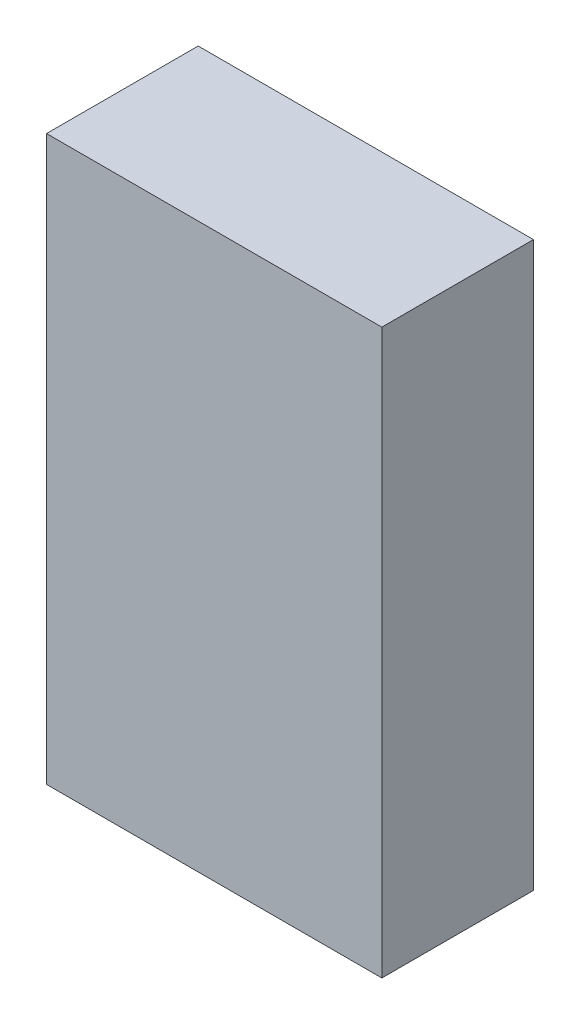
ISO-10303-21;
HEADER;
FILE_DESCRIPTION(('STEP AP214'),'2;1');
FILE_NAME('part.step','',(''),(''),'','','');
FILE_SCHEMA(('AUTOMOTIVE_DESIGN { 1 0 10303 214 1 1 1 1 }'));
ENDSEC;
DATA;
#1=APPLICATION_CONTEXT('core data for automotive mechanical design processes');
#2=APPLICATION_PROTOCOL_DEFINITION('international standard','automotive_design',2000,#1);
#3=PRODUCT_CONTEXT('',#1,'mechanical');
#4=PRODUCT('Part','Part','',(#3));
#5=PRODUCT_RELATED_PRODUCT_CATEGORY('part','',(#4));
#6=PRODUCT_DEFINITION_FORMATION('','',#4);
#7=PRODUCT_DEFINITION_CONTEXT('part definition',#1,'design');
#8=PRODUCT_DEFINITION('design','',#6,#7);
#9=PRODUCT_DEFINITION_SHAPE('','',#8);
#10=(LENGTH_UNIT() NAMED_UNIT(*) SI_UNIT(.MILLI.,.METRE.));
#11=(NAMED_UNIT(*) PLANE_ANGLE_UNIT() SI_UNIT($,.RADIAN.));
#12=(NAMED_UNIT(*) SI_UNIT($,.STERADIAN.) SOLID_ANGLE_UNIT());
#13=UNCERTAINTY_MEASURE_WITH_UNIT(LENGTH_MEASURE(1.E-05),#10,'distance_accuracy_value','');
#14=(GEOMETRIC_REPRESENTATION_CONTEXT(3) GLOBAL_UNCERTAINTY_ASSIGNED_CONTEXT((#13)) GLOBAL_UNIT_ASSIGNED_CONTEXT((#10,
#11,#12)) REPRESENTATION_CONTEXT('',''));
#15=CARTESIAN_POINT('',(0.,0.,0.));
#16=DIRECTION('',(0.,0.,1.));
#17=DIRECTION('',(1.,0.,0.));
#18=AXIS2_PLACEMENT_3D('',#15,#16,#17);
#19=CARTESIAN_POINT('',(17.25,-29.,15.6));
#20=DIRECTION('',(-1.,0.,0.));
#21=DIRECTION('',(0.,0.,1.));
#22=AXIS2_PLACEMENT_3D('',#19,#20,#21);
#23=PLANE('',#22);
#24=DIRECTION('',(0.,1.,0.));
#25=VECTOR('',#24,1.);
#26=CARTESIAN_POINT('',(17.25,-29.,0.));
#27=LINE('',#26,#25);
#28=CARTESIAN_POINT('',(17.25,-29.,0.));
#29=VERTEX_POINT('',#28);
#30=CARTESIAN_POINT('',(17.25,29.,0.));
#31=VERTEX_POINT('',#30);
#32=EDGE_CURVE('E112',#29,#31,#27,.T.);
#33=ORIENTED_EDGE('',*,*,#32,.T.);
#34=DIRECTION('',(0.,0.,-1.));
#35=VECTOR('',#34,1.);
#36=CARTESIAN_POINT('',(17.25,29.,15.6));
#37=LINE('',#36,#35);
#38=CARTESIAN_POINT('',(17.25,29.,15.6));
#39=VERTEX_POINT('',#38);
#40=EDGE_CURVE('E11',#39,#31,#37,.T.);
#41=ORIENTED_EDGE('',*,*,#40,.F.);
#42=DIRECTION('',(0.,1.,0.));
#43=VECTOR('',#42,1.);
#44=CARTESIAN_POINT('',(17.25,-29.,15.6));
#45=LINE('',#44,#43);
#46=CARTESIAN_POINT('',(17.25,-29.,15.6));
#47=VERTEX_POINT('',#46);
#48=EDGE_CURVE('E95',#47,#39,#45,.T.);
#49=ORIENTED_EDGE('',*,*,#48,.F.);
#50=DIRECTION('',(0.,0.,-1.));
#51=VECTOR('',#50,1.);
#52=CARTESIAN_POINT('',(17.25,-29.,15.6));
#53=LINE('',#52,#51);
#54=EDGE_CURVE('E108',#47,#29,#53,.T.);
#55=ORIENTED_EDGE('',*,*,#54,.T.);
#56=EDGE_LOOP('',(#33,#41,#49,#55));
#57=FACE_BOUND('',#56,.T.);
#58=ADVANCED_FACE('F43',(#57),#23,.F.);
#59=CARTESIAN_POINT('',(-17.25,29.,15.6));
#60=DIRECTION('',(0.,-1.,0.));
#61=DIRECTION('',(0.,0.,-1.));
#62=AXIS2_PLACEMENT_3D('',#59,#60,#61);
#63=PLANE('',#62);
#64=DIRECTION('',(-1.,0.,0.));
#65=VECTOR('',#64,1.);
#66=CARTESIAN_POINT('',(-17.25,29.,0.));
#67=LINE('',#66,#65);
#68=CARTESIAN_POINT('',(-17.25,29.,0.));
#69=VERTEX_POINT('',#68);
#70=EDGE_CURVE('E100',#31,#69,#67,.T.);
#71=ORIENTED_EDGE('',*,*,#70,.T.);
#72=DIRECTION('',(0.,0.,-1.));
#73=VECTOR('',#72,1.);
#74=CARTESIAN_POINT('',(-17.25,29.,15.6));
#75=LINE('',#74,#73);
#76=CARTESIAN_POINT('',(-17.25,29.,15.6));
#77=VERTEX_POINT('',#76);
#78=EDGE_CURVE('E52',#77,#69,#75,.T.);
#79=ORIENTED_EDGE('',*,*,#78,.F.);
#80=DIRECTION('',(-1.,0.,0.));
#81=VECTOR('',#80,1.);
#82=CARTESIAN_POINT('',(-17.25,29.,15.6));
#83=LINE('',#82,#81);
#84=EDGE_CURVE('E90',#39,#77,#83,.T.);
#85=ORIENTED_EDGE('',*,*,#84,.F.);
#86=ORIENTED_EDGE('',*,*,#40,.T.);
#87=EDGE_LOOP('',(#71,#79,#85,#86));
#88=FACE_BOUND('',#87,.T.);
#89=ADVANCED_FACE('F99',(#88),#63,.F.);
#90=CARTESIAN_POINT('',(-17.25,-29.,15.6));
#91=DIRECTION('',(1.,0.,0.));
#92=DIRECTION('',(0.,0.,-1.));
#93=AXIS2_PLACEMENT_3D('',#90,#91,#92);
#94=PLANE('',#93);
#95=DIRECTION('',(0.,-1.,0.));
#96=VECTOR('',#95,1.);
#97=CARTESIAN_POINT('',(-17.25,-29.,0.));
#98=LINE('',#97,#96);
#99=CARTESIAN_POINT('',(-17.25,-29.,0.));
#100=VERTEX_POINT('',#99);
#101=EDGE_CURVE('E77',#69,#100,#98,.T.);
#102=ORIENTED_EDGE('',*,*,#101,.T.);
#103=DIRECTION('',(0.,0.,-1.));
#104=VECTOR('',#103,1.);
#105=CARTESIAN_POINT('',(-17.25,-29.,15.6));
#106=LINE('',#105,#104);
#107=CARTESIAN_POINT('',(-17.25,-29.,15.6));
#108=VERTEX_POINT('',#107);
#109=EDGE_CURVE('E102',#108,#100,#106,.T.);
#110=ORIENTED_EDGE('',*,*,#109,.F.);
#111=DIRECTION('',(0.,-1.,0.));
#112=VECTOR('',#111,1.);
#113=CARTESIAN_POINT('',(-17.25,-29.,15.6));
#114=LINE('',#113,#112);
#115=EDGE_CURVE('E93',#77,#108,#114,.T.);
#116=ORIENTED_EDGE('',*,*,#115,.F.);
#117=ORIENTED_EDGE('',*,*,#78,.T.);
#118=EDGE_LOOP('',(#102,#110,#116,#117));
#119=FACE_BOUND('',#118,.T.);
#120=ADVANCED_FACE('F103',(#119),#94,.F.);
#121=CARTESIAN_POINT('',(-17.25,-29.,15.6));
#122=DIRECTION('',(0.,1.,0.));
#123=DIRECTION('',(0.,0.,1.));
#124=AXIS2_PLACEMENT_3D('',#121,#122,#123);
#125=PLANE('',#124);
#126=DIRECTION('',(1.,0.,0.));
#127=VECTOR('',#126,1.);
#128=CARTESIAN_POINT('',(-17.25,-29.,0.));
#129=LINE('',#128,#127);
#130=EDGE_CURVE('E83',#100,#29,#129,.T.);
#131=ORIENTED_EDGE('',*,*,#130,.T.);
#132=ORIENTED_EDGE('',*,*,#54,.F.);
#133=DIRECTION('',(1.,0.,0.));
#134=VECTOR('',#133,1.);
#135=CARTESIAN_POINT('',(-17.25,-29.,15.6));
#136=LINE('',#135,#134);
#137=EDGE_CURVE('E60',#108,#47,#136,.T.);
#138=ORIENTED_EDGE('',*,*,#137,.F.);
#139=ORIENTED_EDGE('',*,*,#109,.T.);
#140=EDGE_LOOP('',(#131,#132,#138,#139));
#141=FACE_BOUND('',#140,.T.);
#142=ADVANCED_FACE('F124',(#141),#125,.F.);
#143=CARTESIAN_POINT('',(0.,0.,15.6));
#144=DIRECTION('',(0.,0.,-1.));
#145=DIRECTION('',(-1.,0.,0.));
#146=AXIS2_PLACEMENT_3D('',#143,#144,#145);
#147=PLANE('',#146);
#148=ORIENTED_EDGE('',*,*,#48,.T.);
#149=ORIENTED_EDGE('',*,*,#84,.T.);
#150=ORIENTED_EDGE('',*,*,#115,.T.);
#151=ORIENTED_EDGE('',*,*,#137,.T.);
#152=EDGE_LOOP('',(#148,#149,#150,#151));
#153=FACE_BOUND('',#152,.T.);
#154=ADVANCED_FACE('F91',(#153),#147,.F.);
#155=CARTESIAN_POINT('',(0.,0.,0.));
#156=DIRECTION('',(0.,0.,-1.));
#157=DIRECTION('',(-1.,0.,0.));
#158=AXIS2_PLACEMENT_3D('',#155,#156,#157);
#159=PLANE('',#158);
#160=ORIENTED_EDGE('',*,*,#32,.F.);
#161=ORIENTED_EDGE('',*,*,#130,.F.);
#162=ORIENTED_EDGE('',*,*,#101,.F.);
#163=ORIENTED_EDGE('',*,*,#70,.F.);
#164=EDGE_LOOP('',(#160,#161,#162,#163));
#165=FACE_BOUND('',#164,.T.);
#166=ADVANCED_FACE('F127',(#165),#159,.T.);
#167=CLOSED_SHELL('',(#58,#89,#120,#142,#154,#166));
#168=MANIFOLD_SOLID_BREP('B2',#167);
#169=ADVANCED_BREP_SHAPE_REPRESENTATION('',(#18,#168),#14);
#170=SHAPE_DEFINITION_REPRESENTATION(#9,#169);
ENDSEC;
END-ISO-10303-21;
